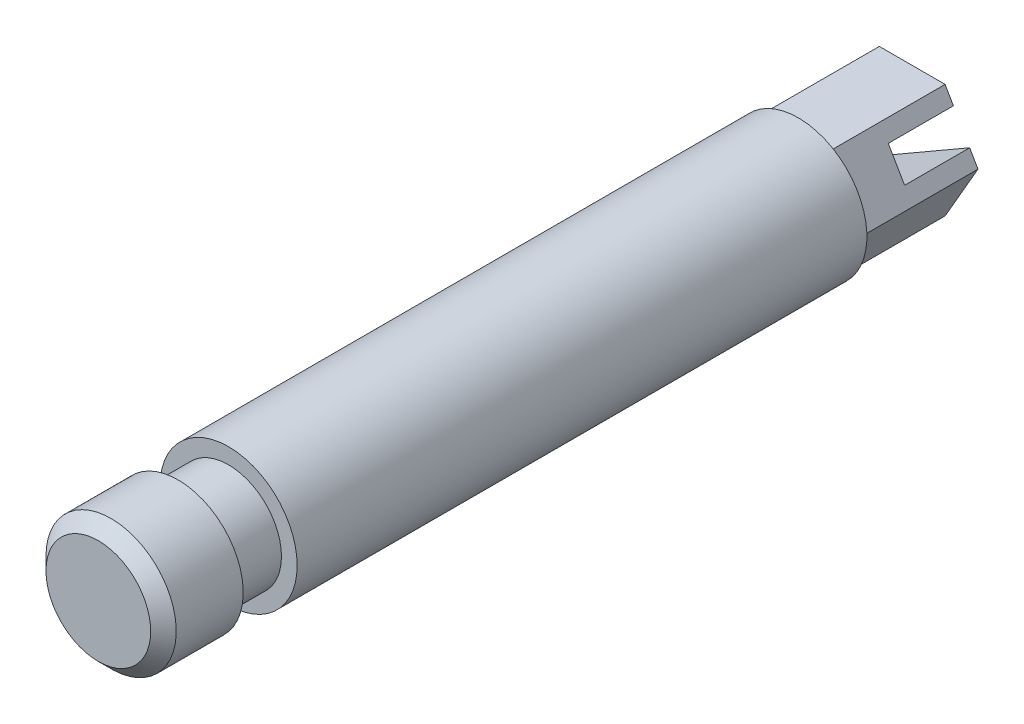
ISO-10303-21;
HEADER;
FILE_DESCRIPTION(('STEP AP214'),'2;1');
FILE_NAME('part.step','',(''),(''),'','','');
FILE_SCHEMA(('AUTOMOTIVE_DESIGN { 1 0 10303 214 1 1 1 1 }'));
ENDSEC;
DATA;
#1=APPLICATION_CONTEXT('core data for automotive mechanical design processes');
#2=APPLICATION_PROTOCOL_DEFINITION('international standard','automotive_design',2000,#1);
#3=PRODUCT_CONTEXT('',#1,'mechanical');
#4=PRODUCT('Part','Part','',(#3));
#5=PRODUCT_RELATED_PRODUCT_CATEGORY('part','',(#4));
#6=PRODUCT_DEFINITION_FORMATION('','',#4);
#7=PRODUCT_DEFINITION_CONTEXT('part definition',#1,'design');
#8=PRODUCT_DEFINITION('design','',#6,#7);
#9=PRODUCT_DEFINITION_SHAPE('','',#8);
#10=(LENGTH_UNIT() NAMED_UNIT(*) SI_UNIT(.MILLI.,.METRE.));
#11=(NAMED_UNIT(*) PLANE_ANGLE_UNIT() SI_UNIT($,.RADIAN.));
#12=(NAMED_UNIT(*) SI_UNIT($,.STERADIAN.) SOLID_ANGLE_UNIT());
#13=UNCERTAINTY_MEASURE_WITH_UNIT(LENGTH_MEASURE(1.E-05),#10,'distance_accuracy_value','');
#14=(GEOMETRIC_REPRESENTATION_CONTEXT(3) GLOBAL_UNCERTAINTY_ASSIGNED_CONTEXT((#13)) GLOBAL_UNIT_ASSIGNED_CONTEXT((#10,
#11,#12)) REPRESENTATION_CONTEXT('',''));
#15=CARTESIAN_POINT('',(0.,0.,0.));
#16=DIRECTION('',(0.,0.,1.));
#17=DIRECTION('',(1.,0.,0.));
#18=AXIS2_PLACEMENT_3D('',#15,#16,#17);
#19=CARTESIAN_POINT('',(0.,0.,0.));
#20=DIRECTION('',(0.,0.,1.));
#21=DIRECTION('',(1.,0.,0.));
#22=AXIS2_PLACEMENT_3D('',#19,#20,#21);
#23=PLANE('',#22);
#24=DIRECTION('',(0.5,-0.866025403784439,0.));
#25=VECTOR('',#24,1.);
#26=CARTESIAN_POINT('',(2.02072594216369,3.5,0.));
#27=LINE('',#26,#25);
#28=CARTESIAN_POINT('',(2.02072594216369,3.5,0.));
#29=VERTEX_POINT('',#28);
#30=CARTESIAN_POINT('',(2.53108891324554,2.61602540378444,0.));
#31=VERTEX_POINT('',#30);
#32=EDGE_CURVE('E43',#29,#31,#27,.T.);
#33=ORIENTED_EDGE('',*,*,#32,.T.);
#34=DIRECTION('',(0.866025403784439,0.5,0.));
#35=VECTOR('',#34,1.);
#36=CARTESIAN_POINT('',(2.53108891324554,2.61602540378444,0.));
#37=LINE('',#36,#35);
#38=CARTESIAN_POINT('',(-3.53108891324554,-0.883974596215562,0.));
#39=VERTEX_POINT('',#38);
#40=EDGE_CURVE('E112',#39,#31,#37,.T.);
#41=ORIENTED_EDGE('',*,*,#40,.F.);
#42=DIRECTION('',(-0.5,0.866025403784439,0.));
#43=VECTOR('',#42,1.);
#44=CARTESIAN_POINT('',(-2.02072594216369,-3.5,0.));
#45=LINE('',#44,#43);
#46=CARTESIAN_POINT('',(-4.04145188432738,0.,0.));
#47=VERTEX_POINT('',#46);
#48=EDGE_CURVE('E161',#39,#47,#45,.T.);
#49=ORIENTED_EDGE('',*,*,#48,.T.);
#50=DIRECTION('',(0.5,0.866025403784439,0.));
#51=VECTOR('',#50,1.);
#52=CARTESIAN_POINT('',(-4.04145188432738,0.,0.));
#53=LINE('',#52,#51);
#54=CARTESIAN_POINT('',(-2.02072594216369,3.5,0.));
#55=VERTEX_POINT('',#54);
#56=EDGE_CURVE('E148',#47,#55,#53,.T.);
#57=ORIENTED_EDGE('',*,*,#56,.T.);
#58=DIRECTION('',(1.,0.,0.));
#59=VECTOR('',#58,1.);
#60=CARTESIAN_POINT('',(-2.02072594216369,3.5,0.));
#61=LINE('',#60,#59);
#62=EDGE_CURVE('E151',#55,#29,#61,.T.);
#63=ORIENTED_EDGE('',*,*,#62,.T.);
#64=EDGE_LOOP('',(#33,#41,#49,#57,#63));
#65=FACE_BOUND('',#64,.T.);
#66=ADVANCED_FACE('F17',(#65),#23,.F.);
#67=CARTESIAN_POINT('',(0.,0.,45.1));
#68=DIRECTION('',(0.,0.,1.));
#69=DIRECTION('',(1.,0.,0.));
#70=AXIS2_PLACEMENT_3D('',#67,#68,#69);
#71=PLANE('',#70);
#72=CARTESIAN_POINT('',(0.,0.,45.1));
#73=DIRECTION('',(0.,0.,1.));
#74=DIRECTION('',(1.,0.,0.));
#75=AXIS2_PLACEMENT_3D('',#72,#73,#74);
#76=CIRCLE('',#75,3.25);
#77=CARTESIAN_POINT('',(3.25,0.,45.1));
#78=VERTEX_POINT('',#77);
#79=EDGE_CURVE('E180',#78,#78,#76,.T.);
#80=ORIENTED_EDGE('',*,*,#79,.T.);
#81=EDGE_LOOP('',(#80));
#82=FACE_BOUND('',#81,.T.);
#83=CARTESIAN_POINT('',(0.,0.,45.1));
#84=DIRECTION('',(0.,0.,-1.));
#85=DIRECTION('',(-1.,0.,0.));
#86=AXIS2_PLACEMENT_3D('',#83,#84,#85);
#87=CIRCLE('',#86,4.);
#88=CARTESIAN_POINT('',(-4.,0.,45.1));
#89=VERTEX_POINT('',#88);
#90=EDGE_CURVE('E124',#89,#89,#87,.T.);
#91=ORIENTED_EDGE('',*,*,#90,.T.);
#92=EDGE_LOOP('',(#91));
#93=FACE_BOUND('',#92,.T.);
#94=ADVANCED_FACE('F192',(#82,#93),#71,.F.);
#95=CARTESIAN_POINT('',(0.,0.,50.));
#96=DIRECTION('',(0.,0.,-1.));
#97=DIRECTION('',(-1.,0.,0.));
#98=AXIS2_PLACEMENT_3D('',#95,#96,#97);
#99=CYLINDRICAL_SURFACE('',#98,4.215);
#100=CARTESIAN_POINT('',(0.,0.,42.));
#101=DIRECTION('',(0.,0.,1.));
#102=DIRECTION('',(1.,0.,0.));
#103=AXIS2_PLACEMENT_3D('',#100,#101,#102);
#104=CIRCLE('',#103,4.215);
#105=CARTESIAN_POINT('',(4.215,0.,42.));
#106=VERTEX_POINT('',#105);
#107=EDGE_CURVE('E27',#106,#106,#104,.T.);
#108=ORIENTED_EDGE('',*,*,#107,.F.);
#109=EDGE_LOOP('',(#108));
#110=FACE_BOUND('',#109,.T.);
#111=CARTESIAN_POINT('',(0.,0.,7.));
#112=DIRECTION('',(0.,0.,-1.));
#113=DIRECTION('',(-1.,0.,0.));
#114=AXIS2_PLACEMENT_3D('',#111,#112,#113);
#115=CIRCLE('',#114,4.215);
#116=CARTESIAN_POINT('',(-4.215,0.,7.));
#117=VERTEX_POINT('',#116);
#118=EDGE_CURVE('E167',#117,#117,#115,.T.);
#119=ORIENTED_EDGE('',*,*,#118,.F.);
#120=EDGE_LOOP('',(#119));
#121=FACE_BOUND('',#120,.T.);
#122=ADVANCED_FACE('F189',(#110,#121),#99,.T.);
#123=CARTESIAN_POINT('',(0.,0.,42.));
#124=DIRECTION('',(0.,0.,1.));
#125=DIRECTION('',(1.,0.,0.));
#126=AXIS2_PLACEMENT_3D('',#123,#124,#125);
#127=PLANE('',#126);
#128=CARTESIAN_POINT('',(0.,0.,42.));
#129=DIRECTION('',(0.,0.,1.));
#130=DIRECTION('',(1.,0.,0.));
#131=AXIS2_PLACEMENT_3D('',#128,#129,#130);
#132=CIRCLE('',#131,3.25);
#133=CARTESIAN_POINT('',(3.25,0.,42.));
#134=VERTEX_POINT('',#133);
#135=EDGE_CURVE('E177',#134,#134,#132,.T.);
#136=ORIENTED_EDGE('',*,*,#135,.F.);
#137=EDGE_LOOP('',(#136));
#138=FACE_BOUND('',#137,.T.);
#139=ORIENTED_EDGE('',*,*,#107,.T.);
#140=EDGE_LOOP('',(#139));
#141=FACE_BOUND('',#140,.T.);
#142=ADVANCED_FACE('F191',(#138,#141),#127,.T.);
#143=CARTESIAN_POINT('',(0.,0.,42.));
#144=DIRECTION('',(0.,0.,1.));
#145=DIRECTION('',(1.,0.,0.));
#146=AXIS2_PLACEMENT_3D('',#143,#144,#145);
#147=CYLINDRICAL_SURFACE('',#146,3.25);
#148=ORIENTED_EDGE('',*,*,#135,.T.);
#149=EDGE_LOOP('',(#148));
#150=FACE_BOUND('',#149,.T.);
#151=ORIENTED_EDGE('',*,*,#79,.F.);
#152=EDGE_LOOP('',(#151));
#153=FACE_BOUND('',#152,.T.);
#154=ADVANCED_FACE('F200',(#150,#153),#147,.T.);
#155=CARTESIAN_POINT('',(0.,0.,7.));
#156=DIRECTION('',(0.,0.,-1.));
#157=DIRECTION('',(-1.,0.,0.));
#158=AXIS2_PLACEMENT_3D('',#155,#156,#157);
#159=PLANE('',#158);
#160=DIRECTION('',(-0.5,0.866025403784439,0.));
#161=VECTOR('',#160,1.);
#162=CARTESIAN_POINT('',(-2.02072594216369,-3.5,7.));
#163=LINE('',#162,#161);
#164=CARTESIAN_POINT('',(-2.02072594216369,-3.5,7.));
#165=VERTEX_POINT('',#164);
#166=CARTESIAN_POINT('',(-4.04145188432738,0.,7.));
#167=VERTEX_POINT('',#166);
#168=EDGE_CURVE('E144',#165,#167,#163,.T.);
#169=ORIENTED_EDGE('',*,*,#168,.F.);
#170=DIRECTION('',(-1.,0.,0.));
#171=VECTOR('',#170,1.);
#172=CARTESIAN_POINT('',(2.02072594216369,-3.5,7.));
#173=LINE('',#172,#171);
#174=CARTESIAN_POINT('',(2.02072594216369,-3.5,7.));
#175=VERTEX_POINT('',#174);
#176=EDGE_CURVE('E141',#175,#165,#173,.T.);
#177=ORIENTED_EDGE('',*,*,#176,.F.);
#178=DIRECTION('',(-0.5,-0.866025403784439,0.));
#179=VECTOR('',#178,1.);
#180=CARTESIAN_POINT('',(4.04145188432738,0.,7.));
#181=LINE('',#180,#179);
#182=CARTESIAN_POINT('',(4.04145188432738,0.,7.));
#183=VERTEX_POINT('',#182);
#184=EDGE_CURVE('E138',#183,#175,#181,.T.);
#185=ORIENTED_EDGE('',*,*,#184,.F.);
#186=DIRECTION('',(0.5,-0.866025403784439,0.));
#187=VECTOR('',#186,1.);
#188=CARTESIAN_POINT('',(2.02072594216369,3.5,7.));
#189=LINE('',#188,#187);
#190=CARTESIAN_POINT('',(2.02072594216369,3.5,7.));
#191=VERTEX_POINT('',#190);
#192=EDGE_CURVE('E135',#191,#183,#189,.T.);
#193=ORIENTED_EDGE('',*,*,#192,.F.);
#194=DIRECTION('',(1.,0.,0.));
#195=VECTOR('',#194,1.);
#196=CARTESIAN_POINT('',(-2.02072594216369,3.5,7.));
#197=LINE('',#196,#195);
#198=CARTESIAN_POINT('',(-2.02072594216369,3.5,7.));
#199=VERTEX_POINT('',#198);
#200=EDGE_CURVE('E131',#199,#191,#197,.T.);
#201=ORIENTED_EDGE('',*,*,#200,.F.);
#202=DIRECTION('',(0.5,0.866025403784439,0.));
#203=VECTOR('',#202,1.);
#204=CARTESIAN_POINT('',(-4.04145188432738,0.,7.));
#205=LINE('',#204,#203);
#206=EDGE_CURVE('E128',#167,#199,#205,.T.);
#207=ORIENTED_EDGE('',*,*,#206,.F.);
#208=EDGE_LOOP('',(#169,#177,#185,#193,#201,#207));
#209=FACE_BOUND('',#208,.T.);
#210=ORIENTED_EDGE('',*,*,#118,.T.);
#211=EDGE_LOOP('',(#210));
#212=FACE_BOUND('',#211,.T.);
#213=ADVANCED_FACE('F187',(#209,#212),#159,.T.);
#214=CARTESIAN_POINT('',(-4.04145188432738,0.,7.));
#215=DIRECTION('',(-0.866025403784439,0.5,0.));
#216=DIRECTION('',(-0.5,-0.866025403784439,0.));
#217=AXIS2_PLACEMENT_3D('',#214,#215,#216);
#218=PLANE('',#217);
#219=ORIENTED_EDGE('',*,*,#56,.F.);
#220=DIRECTION('',(0.,0.,-1.));
#221=VECTOR('',#220,1.);
#222=CARTESIAN_POINT('',(-4.04145188432738,0.,7.));
#223=LINE('',#222,#221);
#224=EDGE_CURVE('E164',#167,#47,#223,.T.);
#225=ORIENTED_EDGE('',*,*,#224,.F.);
#226=ORIENTED_EDGE('',*,*,#206,.T.);
#227=DIRECTION('',(0.,0.,-1.));
#228=VECTOR('',#227,1.);
#229=CARTESIAN_POINT('',(-2.02072594216369,3.5,7.));
#230=LINE('',#229,#228);
#231=EDGE_CURVE('E147',#199,#55,#230,.T.);
#232=ORIENTED_EDGE('',*,*,#231,.T.);
#233=EDGE_LOOP('',(#219,#225,#226,#232));
#234=FACE_BOUND('',#233,.T.);
#235=ADVANCED_FACE('F246',(#234),#218,.T.);
#236=CARTESIAN_POINT('',(-2.02072594216369,-3.5,7.));
#237=DIRECTION('',(-0.866025403784439,-0.5,0.));
#238=DIRECTION('',(0.5,-0.866025403784439,0.));
#239=AXIS2_PLACEMENT_3D('',#236,#237,#238);
#240=PLANE('',#239);
#241=DIRECTION('',(0.,0.,-1.));
#242=VECTOR('',#241,1.);
#243=CARTESIAN_POINT('',(-3.53108891324554,-0.883974596215562,4.));
#244=LINE('',#243,#242);
#245=CARTESIAN_POINT('',(-3.53108891324554,-0.883974596215562,4.));
#246=VERTEX_POINT('',#245);
#247=EDGE_CURVE('E119',#246,#39,#244,.T.);
#248=ORIENTED_EDGE('',*,*,#247,.F.);
#249=DIRECTION('',(-0.5,0.866025403784439,0.));
#250=VECTOR('',#249,1.);
#251=CARTESIAN_POINT('',(-3.53108891324554,-0.883974596215562,4.));
#252=LINE('',#251,#250);
#253=CARTESIAN_POINT('',(-2.53108891324554,-2.61602540378444,4.));
#254=VERTEX_POINT('',#253);
#255=EDGE_CURVE('E104',#254,#246,#252,.T.);
#256=ORIENTED_EDGE('',*,*,#255,.F.);
#257=DIRECTION('',(0.,0.,-1.));
#258=VECTOR('',#257,1.);
#259=CARTESIAN_POINT('',(-2.53108891324554,-2.61602540378444,4.));
#260=LINE('',#259,#258);
#261=CARTESIAN_POINT('',(-2.53108891324554,-2.61602540378444,0.));
#262=VERTEX_POINT('',#261);
#263=EDGE_CURVE('E101',#254,#262,#260,.T.);
#264=ORIENTED_EDGE('',*,*,#263,.T.);
#265=CARTESIAN_POINT('',(-2.02072594216369,-3.5,0.));
#266=VERTEX_POINT('',#265);
#267=EDGE_CURVE('E132',#266,#262,#45,.T.);
#268=ORIENTED_EDGE('',*,*,#267,.F.);
#269=DIRECTION('',(0.,0.,-1.));
#270=VECTOR('',#269,1.);
#271=CARTESIAN_POINT('',(-2.02072594216369,-3.5,7.));
#272=LINE('',#271,#270);
#273=EDGE_CURVE('E168',#165,#266,#272,.T.);
#274=ORIENTED_EDGE('',*,*,#273,.F.);
#275=ORIENTED_EDGE('',*,*,#168,.T.);
#276=ORIENTED_EDGE('',*,*,#224,.T.);
#277=ORIENTED_EDGE('',*,*,#48,.F.);
#278=EDGE_LOOP('',(#248,#256,#264,#268,#274,#275,#276,#277));
#279=FACE_BOUND('',#278,.T.);
#280=ADVANCED_FACE('F233',(#279),#240,.T.);
#281=CARTESIAN_POINT('',(2.02072594216369,-3.5,7.));
#282=DIRECTION('',(0.,-1.,0.));
#283=DIRECTION('',(1.,0.,0.));
#284=AXIS2_PLACEMENT_3D('',#281,#282,#283);
#285=PLANE('',#284);
#286=DIRECTION('',(-1.,0.,0.));
#287=VECTOR('',#286,1.);
#288=CARTESIAN_POINT('',(2.02072594216369,-3.5,0.));
#289=LINE('',#288,#287);
#290=CARTESIAN_POINT('',(2.02072594216369,-3.5,0.));
#291=VERTEX_POINT('',#290);
#292=EDGE_CURVE('E158',#291,#266,#289,.T.);
#293=ORIENTED_EDGE('',*,*,#292,.F.);
#294=DIRECTION('',(0.,0.,-1.));
#295=VECTOR('',#294,1.);
#296=CARTESIAN_POINT('',(2.02072594216369,-3.5,7.));
#297=LINE('',#296,#295);
#298=EDGE_CURVE('E170',#175,#291,#297,.T.);
#299=ORIENTED_EDGE('',*,*,#298,.F.);
#300=ORIENTED_EDGE('',*,*,#176,.T.);
#301=ORIENTED_EDGE('',*,*,#273,.T.);
#302=EDGE_LOOP('',(#293,#299,#300,#301));
#303=FACE_BOUND('',#302,.T.);
#304=ADVANCED_FACE('F256',(#303),#285,.T.);
#305=CARTESIAN_POINT('',(4.04145188432738,0.,7.));
#306=DIRECTION('',(0.866025403784439,-0.5,0.));
#307=DIRECTION('',(0.5,0.866025403784439,0.));
#308=AXIS2_PLACEMENT_3D('',#305,#306,#307);
#309=PLANE('',#308);
#310=DIRECTION('',(-0.5,-0.866025403784439,0.));
#311=VECTOR('',#310,1.);
#312=CARTESIAN_POINT('',(4.04145188432738,0.,0.));
#313=LINE('',#312,#311);
#314=CARTESIAN_POINT('',(4.04145188432738,0.,0.));
#315=VERTEX_POINT('',#314);
#316=EDGE_CURVE('E155',#315,#291,#313,.T.);
#317=ORIENTED_EDGE('',*,*,#316,.F.);
#318=DIRECTION('',(0.,0.,-1.));
#319=VECTOR('',#318,1.);
#320=CARTESIAN_POINT('',(4.04145188432738,0.,7.));
#321=LINE('',#320,#319);
#322=EDGE_CURVE('E172',#183,#315,#321,.T.);
#323=ORIENTED_EDGE('',*,*,#322,.F.);
#324=ORIENTED_EDGE('',*,*,#184,.T.);
#325=ORIENTED_EDGE('',*,*,#298,.T.);
#326=EDGE_LOOP('',(#317,#323,#324,#325));
#327=FACE_BOUND('',#326,.T.);
#328=ADVANCED_FACE('F254',(#327),#309,.T.);
#329=CARTESIAN_POINT('',(2.02072594216369,3.5,7.));
#330=DIRECTION('',(0.866025403784439,0.5,0.));
#331=DIRECTION('',(-0.5,0.866025403784439,0.));
#332=AXIS2_PLACEMENT_3D('',#329,#330,#331);
#333=PLANE('',#332);
#334=DIRECTION('',(0.,0.,-1.));
#335=VECTOR('',#334,1.);
#336=CARTESIAN_POINT('',(2.53108891324554,2.61602540378444,4.));
#337=LINE('',#336,#335);
#338=CARTESIAN_POINT('',(2.53108891324554,2.61602540378444,4.));
#339=VERTEX_POINT('',#338);
#340=EDGE_CURVE('E127',#339,#31,#337,.T.);
#341=ORIENTED_EDGE('',*,*,#340,.T.);
#342=ORIENTED_EDGE('',*,*,#32,.F.);
#343=DIRECTION('',(0.,0.,-1.));
#344=VECTOR('',#343,1.);
#345=CARTESIAN_POINT('',(2.02072594216369,3.5,7.));
#346=LINE('',#345,#344);
#347=EDGE_CURVE('E174',#191,#29,#346,.T.);
#348=ORIENTED_EDGE('',*,*,#347,.F.);
#349=ORIENTED_EDGE('',*,*,#192,.T.);
#350=ORIENTED_EDGE('',*,*,#322,.T.);
#351=CARTESIAN_POINT('',(3.53108891324554,0.883974596215561,0.));
#352=VERTEX_POINT('',#351);
#353=EDGE_CURVE('E117',#352,#315,#27,.T.);
#354=ORIENTED_EDGE('',*,*,#353,.F.);
#355=DIRECTION('',(0.,0.,-1.));
#356=VECTOR('',#355,1.);
#357=CARTESIAN_POINT('',(3.53108891324554,0.883974596215562,4.));
#358=LINE('',#357,#356);
#359=CARTESIAN_POINT('',(3.53108891324554,0.883974596215562,4.));
#360=VERTEX_POINT('',#359);
#361=EDGE_CURVE('E35',#360,#352,#358,.T.);
#362=ORIENTED_EDGE('',*,*,#361,.F.);
#363=DIRECTION('',(0.5,-0.866025403784439,0.));
#364=VECTOR('',#363,1.);
#365=CARTESIAN_POINT('',(2.53108891324554,2.61602540378444,4.));
#366=LINE('',#365,#364);
#367=EDGE_CURVE('E105',#339,#360,#366,.T.);
#368=ORIENTED_EDGE('',*,*,#367,.F.);
#369=EDGE_LOOP('',(#341,#342,#348,#349,#350,#354,#362,#368));
#370=FACE_BOUND('',#369,.T.);
#371=ADVANCED_FACE('F115',(#370),#333,.T.);
#372=CARTESIAN_POINT('',(-2.02072594216369,3.5,7.));
#373=DIRECTION('',(0.,1.,0.));
#374=DIRECTION('',(-1.,0.,0.));
#375=AXIS2_PLACEMENT_3D('',#372,#373,#374);
#376=PLANE('',#375);
#377=ORIENTED_EDGE('',*,*,#62,.F.);
#378=ORIENTED_EDGE('',*,*,#231,.F.);
#379=ORIENTED_EDGE('',*,*,#200,.T.);
#380=ORIENTED_EDGE('',*,*,#347,.T.);
#381=EDGE_LOOP('',(#377,#378,#379,#380));
#382=FACE_BOUND('',#381,.T.);
#383=ADVANCED_FACE('F216',(#382),#376,.T.);
#384=ORIENTED_EDGE('',*,*,#267,.T.);
#385=DIRECTION('',(-0.866025403784439,-0.5,0.));
#386=VECTOR('',#385,1.);
#387=CARTESIAN_POINT('',(3.53108891324554,0.883974596215562,0.));
#388=LINE('',#387,#386);
#389=EDGE_CURVE('E229',#352,#262,#388,.T.);
#390=ORIENTED_EDGE('',*,*,#389,.F.);
#391=ORIENTED_EDGE('',*,*,#353,.T.);
#392=ORIENTED_EDGE('',*,*,#316,.T.);
#393=ORIENTED_EDGE('',*,*,#292,.T.);
#394=EDGE_LOOP('',(#384,#390,#391,#392,#393));
#395=FACE_BOUND('',#394,.T.);
#396=ADVANCED_FACE('F209',(#395),#23,.F.);
#397=CARTESIAN_POINT('',(0.,0.,50.));
#398=DIRECTION('',(0.,0.,-1.));
#399=DIRECTION('',(-1.,0.,0.));
#400=AXIS2_PLACEMENT_3D('',#397,#398,#399);
#401=CYLINDRICAL_SURFACE('',#400,4.);
#402=CARTESIAN_POINT('',(0.,0.,49.215));
#403=DIRECTION('',(0.,0.,-1.));
#404=DIRECTION('',(-1.,0.,0.));
#405=AXIS2_PLACEMENT_3D('',#402,#403,#404);
#406=CIRCLE('',#405,4.);
#407=CARTESIAN_POINT('',(-4.,0.,49.215));
#408=VERTEX_POINT('',#407);
#409=EDGE_CURVE('E22',#408,#408,#406,.F.);
#410=ORIENTED_EDGE('',*,*,#409,.F.);
#411=EDGE_LOOP('',(#410));
#412=FACE_BOUND('',#411,.T.);
#413=ORIENTED_EDGE('',*,*,#90,.F.);
#414=EDGE_LOOP('',(#413));
#415=FACE_BOUND('',#414,.T.);
#416=ADVANCED_FACE('F215',(#412,#415),#401,.T.);
#417=CARTESIAN_POINT('',(0.,0.,50.));
#418=DIRECTION('',(0.,0.,1.));
#419=DIRECTION('',(1.,0.,0.));
#420=AXIS2_PLACEMENT_3D('',#417,#418,#419);
#421=PLANE('',#420);
#422=CARTESIAN_POINT('',(0.,0.,50.));
#423=DIRECTION('',(0.,0.,1.));
#424=DIRECTION('',(1.,0.,0.));
#425=AXIS2_PLACEMENT_3D('',#422,#423,#424);
#426=CIRCLE('',#425,3.215);
#427=CARTESIAN_POINT('',(3.215,0.,50.));
#428=VERTEX_POINT('',#427);
#429=EDGE_CURVE('E11',#428,#428,#426,.T.);
#430=ORIENTED_EDGE('',*,*,#429,.T.);
#431=EDGE_LOOP('',(#430));
#432=FACE_BOUND('',#431,.T.);
#433=ADVANCED_FACE('F223',(#432),#421,.T.);
#434=CARTESIAN_POINT('',(0.,0.,50.));
#435=DIRECTION('',(0.,0.,-1.));
#436=DIRECTION('',(-1.,0.,0.));
#437=AXIS2_PLACEMENT_3D('',#434,#435,#436);
#438=CONICAL_SURFACE('',#437,3.215,0.785398163397446);
#439=ORIENTED_EDGE('',*,*,#429,.F.);
#440=EDGE_LOOP('',(#439));
#441=FACE_BOUND('',#440,.T.);
#442=ORIENTED_EDGE('',*,*,#409,.T.);
#443=EDGE_LOOP('',(#442));
#444=FACE_BOUND('',#443,.T.);
#445=ADVANCED_FACE('F20',(#441,#444),#438,.T.);
#446=CARTESIAN_POINT('',(2.53108891324554,2.61602540378444,4.));
#447=DIRECTION('',(-0.5,0.866025403784439,0.));
#448=DIRECTION('',(-0.866025403784439,-0.5,0.));
#449=AXIS2_PLACEMENT_3D('',#446,#447,#448);
#450=PLANE('',#449);
#451=ORIENTED_EDGE('',*,*,#40,.T.);
#452=ORIENTED_EDGE('',*,*,#340,.F.);
#453=DIRECTION('',(0.866025403784439,0.5,0.));
#454=VECTOR('',#453,1.);
#455=CARTESIAN_POINT('',(2.53108891324554,2.61602540378444,4.));
#456=LINE('',#455,#454);
#457=EDGE_CURVE('E111',#246,#339,#456,.T.);
#458=ORIENTED_EDGE('',*,*,#457,.F.);
#459=ORIENTED_EDGE('',*,*,#247,.T.);
#460=EDGE_LOOP('',(#451,#452,#458,#459));
#461=FACE_BOUND('',#460,.T.);
#462=ADVANCED_FACE('F242',(#461),#450,.F.);
#463=CARTESIAN_POINT('',(3.53108891324554,0.883974596215562,4.));
#464=DIRECTION('',(0.5,-0.866025403784439,0.));
#465=DIRECTION('',(0.866025403784439,0.5,0.));
#466=AXIS2_PLACEMENT_3D('',#463,#464,#465);
#467=PLANE('',#466);
#468=ORIENTED_EDGE('',*,*,#389,.T.);
#469=ORIENTED_EDGE('',*,*,#263,.F.);
#470=DIRECTION('',(-0.866025403784439,-0.5,0.));
#471=VECTOR('',#470,1.);
#472=CARTESIAN_POINT('',(3.53108891324554,0.883974596215562,4.));
#473=LINE('',#472,#471);
#474=EDGE_CURVE('E97',#360,#254,#473,.T.);
#475=ORIENTED_EDGE('',*,*,#474,.F.);
#476=ORIENTED_EDGE('',*,*,#361,.T.);
#477=EDGE_LOOP('',(#468,#469,#475,#476));
#478=FACE_BOUND('',#477,.T.);
#479=ADVANCED_FACE('F99',(#478),#467,.F.);
#480=CARTESIAN_POINT('',(0.,0.,4.));
#481=DIRECTION('',(0.,0.,-1.));
#482=DIRECTION('',(0.,1.,0.));
#483=AXIS2_PLACEMENT_3D('',#480,#481,#482);
#484=PLANE('',#483);
#485=ORIENTED_EDGE('',*,*,#367,.T.);
#486=ORIENTED_EDGE('',*,*,#474,.T.);
#487=ORIENTED_EDGE('',*,*,#255,.T.);
#488=ORIENTED_EDGE('',*,*,#457,.T.);
#489=EDGE_LOOP('',(#485,#486,#487,#488));
#490=FACE_BOUND('',#489,.T.);
#491=ADVANCED_FACE('F109',(#490),#484,.T.);
#492=CLOSED_SHELL('',(#66,#94,#122,#142,#154,#213,#235,#280,#304,#328,#371,#383,#396,#416,#433,
#445,#462,#479,#491));
#493=MANIFOLD_SOLID_BREP('B1',#492);
#494=ADVANCED_BREP_SHAPE_REPRESENTATION('',(#18,#493),#14);
#495=SHAPE_DEFINITION_REPRESENTATION(#9,#494);
ENDSEC;
END-ISO-10303-21;
